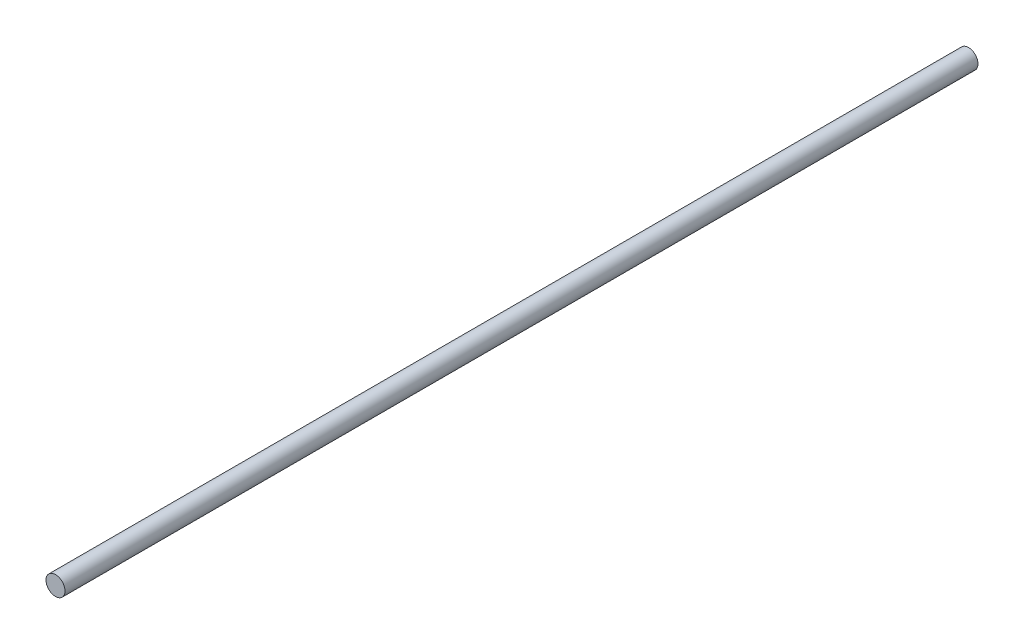
ISO-10303-21;
HEADER;
FILE_DESCRIPTION(('STEP AP214'),'2;1');
FILE_NAME('part.step','',(''),(''),'','','');
FILE_SCHEMA(('AUTOMOTIVE_DESIGN { 1 0 10303 214 1 1 1 1 }'));
ENDSEC;
DATA;
#1=APPLICATION_CONTEXT('core data for automotive mechanical design processes');
#2=APPLICATION_PROTOCOL_DEFINITION('international standard','automotive_design',2000,#1);
#3=PRODUCT_CONTEXT('',#1,'mechanical');
#4=PRODUCT('Part','Part','',(#3));
#5=PRODUCT_RELATED_PRODUCT_CATEGORY('part','',(#4));
#6=PRODUCT_DEFINITION_FORMATION('','',#4);
#7=PRODUCT_DEFINITION_CONTEXT('part definition',#1,'design');
#8=PRODUCT_DEFINITION('design','',#6,#7);
#9=PRODUCT_DEFINITION_SHAPE('','',#8);
#10=(LENGTH_UNIT() NAMED_UNIT(*) SI_UNIT(.MILLI.,.METRE.));
#11=(NAMED_UNIT(*) PLANE_ANGLE_UNIT() SI_UNIT($,.RADIAN.));
#12=(NAMED_UNIT(*) SI_UNIT($,.STERADIAN.) SOLID_ANGLE_UNIT());
#13=UNCERTAINTY_MEASURE_WITH_UNIT(LENGTH_MEASURE(1.E-05),#10,'distance_accuracy_value','');
#14=(GEOMETRIC_REPRESENTATION_CONTEXT(3) GLOBAL_UNCERTAINTY_ASSIGNED_CONTEXT((#13)) GLOBAL_UNIT_ASSIGNED_CONTEXT((#10,
#11,#12)) REPRESENTATION_CONTEXT('',''));
#15=CARTESIAN_POINT('',(0.,0.,0.));
#16=DIRECTION('',(0.,0.,1.));
#17=DIRECTION('',(1.,0.,0.));
#18=AXIS2_PLACEMENT_3D('',#15,#16,#17);
#19=CARTESIAN_POINT('',(0.,0.,480.));
#20=DIRECTION('',(0.,0.,-1.));
#21=DIRECTION('',(-1.,0.,0.));
#22=AXIS2_PLACEMENT_3D('',#19,#20,#21);
#23=CYLINDRICAL_SURFACE('',#22,5.);
#24=CARTESIAN_POINT('',(0.,0.,480.));
#25=DIRECTION('',(0.,0.,1.));
#26=DIRECTION('',(1.,0.,0.));
#27=AXIS2_PLACEMENT_3D('',#24,#25,#26);
#28=CIRCLE('',#27,5.);
#29=CARTESIAN_POINT('',(5.,0.,480.));
#30=VERTEX_POINT('',#29);
#31=EDGE_CURVE('E10',#30,#30,#28,.T.);
#32=ORIENTED_EDGE('',*,*,#31,.F.);
#33=EDGE_LOOP('',(#32));
#34=FACE_BOUND('',#33,.T.);
#35=CARTESIAN_POINT('',(0.,0.,0.));
#36=DIRECTION('',(0.,0.,1.));
#37=DIRECTION('',(1.,0.,0.));
#38=AXIS2_PLACEMENT_3D('',#35,#36,#37);
#39=CIRCLE('',#38,5.);
#40=CARTESIAN_POINT('',(5.,0.,0.));
#41=VERTEX_POINT('',#40);
#42=EDGE_CURVE('E32',#41,#41,#39,.T.);
#43=ORIENTED_EDGE('',*,*,#42,.T.);
#44=EDGE_LOOP('',(#43));
#45=FACE_BOUND('',#44,.T.);
#46=ADVANCED_FACE('F29',(#34,#45),#23,.T.);
#47=CARTESIAN_POINT('',(0.,0.,480.));
#48=DIRECTION('',(0.,0.,1.));
#49=DIRECTION('',(1.,0.,0.));
#50=AXIS2_PLACEMENT_3D('',#47,#48,#49);
#51=PLANE('',#50);
#52=ORIENTED_EDGE('',*,*,#31,.T.);
#53=EDGE_LOOP('',(#52));
#54=FACE_BOUND('',#53,.T.);
#55=ADVANCED_FACE('F44',(#54),#51,.T.);
#56=CARTESIAN_POINT('',(0.,0.,0.));
#57=DIRECTION('',(0.,0.,1.));
#58=DIRECTION('',(1.,0.,0.));
#59=AXIS2_PLACEMENT_3D('',#56,#57,#58);
#60=PLANE('',#59);
#61=ORIENTED_EDGE('',*,*,#42,.F.);
#62=EDGE_LOOP('',(#61));
#63=FACE_BOUND('',#62,.T.);
#64=ADVANCED_FACE('F42',(#63),#60,.F.);
#65=CLOSED_SHELL('',(#46,#55,#64));
#66=MANIFOLD_SOLID_BREP('B2',#65);
#67=ADVANCED_BREP_SHAPE_REPRESENTATION('',(#18,#66),#14);
#68=SHAPE_DEFINITION_REPRESENTATION(#9,#67);
ENDSEC;
END-ISO-10303-21;
